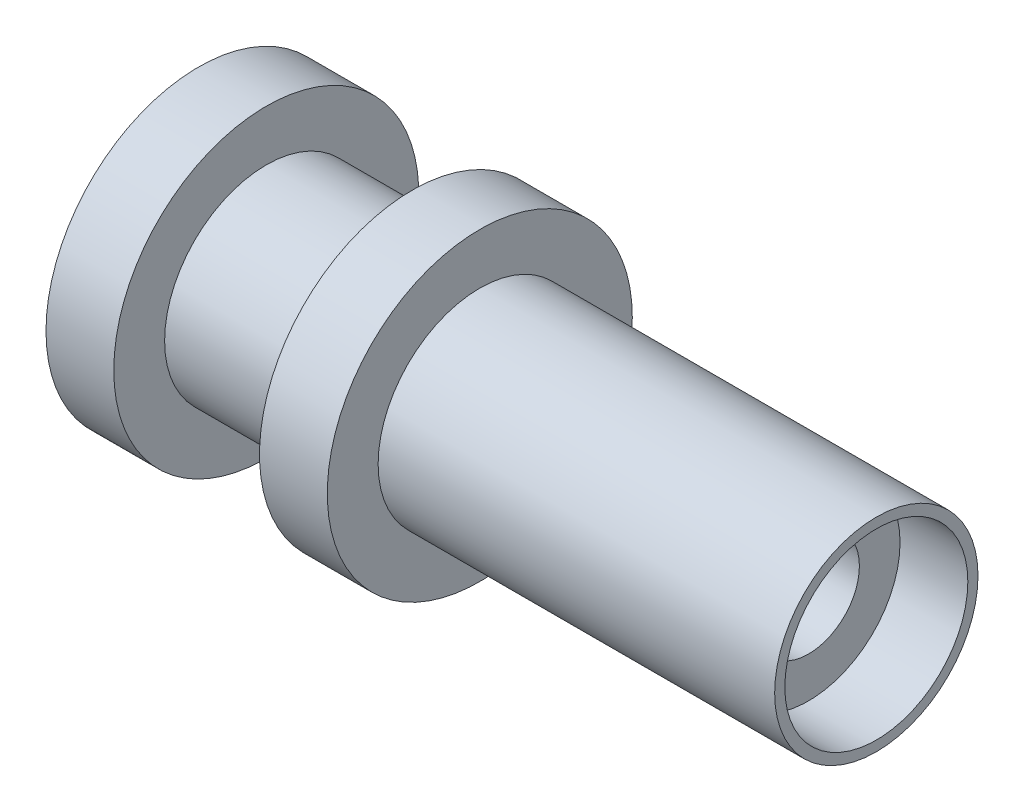
ISO-10303-21;
HEADER;
FILE_DESCRIPTION(('STEP AP214'),'2;1');
FILE_NAME('part.step','',(''),(''),'','','');
FILE_SCHEMA(('AUTOMOTIVE_DESIGN { 1 0 10303 214 1 1 1 1 }'));
ENDSEC;
DATA;
#1=APPLICATION_CONTEXT('core data for automotive mechanical design processes');
#2=APPLICATION_PROTOCOL_DEFINITION('international standard','automotive_design',2000,#1);
#3=PRODUCT_CONTEXT('',#1,'mechanical');
#4=PRODUCT('Part','Part','',(#3));
#5=PRODUCT_RELATED_PRODUCT_CATEGORY('part','',(#4));
#6=PRODUCT_DEFINITION_FORMATION('','',#4);
#7=PRODUCT_DEFINITION_CONTEXT('part definition',#1,'design');
#8=PRODUCT_DEFINITION('design','',#6,#7);
#9=PRODUCT_DEFINITION_SHAPE('','',#8);
#10=(LENGTH_UNIT() NAMED_UNIT(*) SI_UNIT(.MILLI.,.METRE.));
#11=(NAMED_UNIT(*) PLANE_ANGLE_UNIT() SI_UNIT($,.RADIAN.));
#12=(NAMED_UNIT(*) SI_UNIT($,.STERADIAN.) SOLID_ANGLE_UNIT());
#13=UNCERTAINTY_MEASURE_WITH_UNIT(LENGTH_MEASURE(1.E-05),#10,'distance_accuracy_value','');
#14=(GEOMETRIC_REPRESENTATION_CONTEXT(3) GLOBAL_UNCERTAINTY_ASSIGNED_CONTEXT((#13)) GLOBAL_UNIT_ASSIGNED_CONTEXT((#10,
#11,#12)) REPRESENTATION_CONTEXT('',''));
#15=CARTESIAN_POINT('',(0.,0.,0.));
#16=DIRECTION('',(0.,0.,1.));
#17=DIRECTION('',(1.,0.,0.));
#18=AXIS2_PLACEMENT_3D('',#15,#16,#17);
#19=CARTESIAN_POINT('',(-2.,0.,0.));
#20=DIRECTION('',(-1.,0.,0.));
#21=DIRECTION('',(0.,0.,1.));
#22=AXIS2_PLACEMENT_3D('',#19,#20,#21);
#23=PLANE('',#22);
#24=CARTESIAN_POINT('',(-2.,0.,0.));
#25=DIRECTION('',(-1.,0.,0.));
#26=DIRECTION('',(0.,0.,1.));
#27=AXIS2_PLACEMENT_3D('',#24,#25,#26);
#28=CIRCLE('',#27,4.5);
#29=CARTESIAN_POINT('',(-2.,0.,4.5));
#30=VERTEX_POINT('',#29);
#31=EDGE_CURVE('E147',#30,#30,#28,.T.);
#32=ORIENTED_EDGE('',*,*,#31,.T.);
#33=EDGE_LOOP('',(#32));
#34=FACE_BOUND('',#33,.T.);
#35=DIRECTION('',(0.,-1.,0.));
#36=VECTOR('',#35,1.);
#37=CARTESIAN_POINT('',(-2.,0.,2.8));
#38=LINE('',#37,#36);
#39=CARTESIAN_POINT('',(-2.,1.61658075373095,2.8));
#40=VERTEX_POINT('',#39);
#41=CARTESIAN_POINT('',(-2.,-1.61658075373095,2.8));
#42=VERTEX_POINT('',#41);
#43=EDGE_CURVE('E49',#40,#42,#38,.T.);
#44=ORIENTED_EDGE('',*,*,#43,.T.);
#45=DIRECTION('',(0.,-0.5,-0.866025403784439));
#46=VECTOR('',#45,1.);
#47=CARTESIAN_POINT('',(-2.,-2.42487113059643,1.4));
#48=LINE('',#47,#46);
#49=CARTESIAN_POINT('',(-2.,-3.2331615074619,0.));
#50=VERTEX_POINT('',#49);
#51=EDGE_CURVE('E11',#42,#50,#48,.T.);
#52=ORIENTED_EDGE('',*,*,#51,.T.);
#53=DIRECTION('',(0.,0.5,-0.866025403784439));
#54=VECTOR('',#53,1.);
#55=CARTESIAN_POINT('',(-2.,-2.42487113059643,-1.4));
#56=LINE('',#55,#54);
#57=CARTESIAN_POINT('',(-2.,-1.61658075373095,-2.8));
#58=VERTEX_POINT('',#57);
#59=EDGE_CURVE('E142',#50,#58,#56,.T.);
#60=ORIENTED_EDGE('',*,*,#59,.T.);
#61=DIRECTION('',(0.,1.,0.));
#62=VECTOR('',#61,1.);
#63=CARTESIAN_POINT('',(-2.,0.,-2.8));
#64=LINE('',#63,#62);
#65=CARTESIAN_POINT('',(-2.,1.61658075373095,-2.8));
#66=VERTEX_POINT('',#65);
#67=EDGE_CURVE('E170',#58,#66,#64,.T.);
#68=ORIENTED_EDGE('',*,*,#67,.T.);
#69=DIRECTION('',(0.,0.5,0.866025403784439));
#70=VECTOR('',#69,1.);
#71=CARTESIAN_POINT('',(-2.,2.42487113059643,-1.4));
#72=LINE('',#71,#70);
#73=CARTESIAN_POINT('',(-2.,3.2331615074619,0.));
#74=VERTEX_POINT('',#73);
#75=EDGE_CURVE('E173',#66,#74,#72,.T.);
#76=ORIENTED_EDGE('',*,*,#75,.T.);
#77=DIRECTION('',(0.,-0.5,0.866025403784439));
#78=VECTOR('',#77,1.);
#79=CARTESIAN_POINT('',(-2.,2.42487113059643,1.4));
#80=LINE('',#79,#78);
#81=EDGE_CURVE('E176',#74,#40,#80,.T.);
#82=ORIENTED_EDGE('',*,*,#81,.T.);
#83=EDGE_LOOP('',(#44,#52,#60,#68,#76,#82));
#84=FACE_BOUND('',#83,.T.);
#85=ADVANCED_FACE('F41',(#34,#84),#23,.T.);
#86=CARTESIAN_POINT('',(0.,0.,0.));
#87=DIRECTION('',(1.,0.,0.));
#88=DIRECTION('',(0.,0.,-1.));
#89=AXIS2_PLACEMENT_3D('',#86,#87,#88);
#90=CYLINDRICAL_SURFACE('',#89,1.5);
#91=CARTESIAN_POINT('',(16.,0.,0.));
#92=DIRECTION('',(1.,0.,0.));
#93=DIRECTION('',(0.,0.,-1.));
#94=AXIS2_PLACEMENT_3D('',#91,#92,#93);
#95=CIRCLE('',#94,1.5);
#96=CARTESIAN_POINT('',(16.,0.,-1.5));
#97=VERTEX_POINT('',#96);
#98=EDGE_CURVE('E159',#97,#97,#95,.T.);
#99=ORIENTED_EDGE('',*,*,#98,.T.);
#100=EDGE_LOOP('',(#99));
#101=FACE_BOUND('',#100,.T.);
#102=CARTESIAN_POINT('',(-1.,0.,0.));
#103=DIRECTION('',(-1.,0.,0.));
#104=DIRECTION('',(0.,0.,1.));
#105=AXIS2_PLACEMENT_3D('',#102,#103,#104);
#106=CIRCLE('',#105,1.5);
#107=CARTESIAN_POINT('',(-1.,0.,1.5));
#108=VERTEX_POINT('',#107);
#109=EDGE_CURVE('E99',#108,#108,#106,.F.);
#110=ORIENTED_EDGE('',*,*,#109,.F.);
#111=EDGE_LOOP('',(#110));
#112=FACE_BOUND('',#111,.T.);
#113=ADVANCED_FACE('F198',(#101,#112),#90,.F.);
#114=CARTESIAN_POINT('',(18.,0.,0.));
#115=DIRECTION('',(-1.,0.,0.));
#116=DIRECTION('',(0.,0.,1.));
#117=AXIS2_PLACEMENT_3D('',#114,#115,#116);
#118=CYLINDRICAL_SURFACE('',#117,3.);
#119=CARTESIAN_POINT('',(0.,0.,0.));
#120=DIRECTION('',(1.,0.,0.));
#121=DIRECTION('',(0.,0.,-1.));
#122=AXIS2_PLACEMENT_3D('',#119,#120,#121);
#123=CIRCLE('',#122,3.);
#124=CARTESIAN_POINT('',(0.,0.,-3.));
#125=VERTEX_POINT('',#124);
#126=EDGE_CURVE('E150',#125,#125,#123,.T.);
#127=ORIENTED_EDGE('',*,*,#126,.T.);
#128=EDGE_LOOP('',(#127));
#129=FACE_BOUND('',#128,.T.);
#130=CARTESIAN_POINT('',(4.30000000000008,0.,0.));
#131=DIRECTION('',(1.,0.,0.));
#132=DIRECTION('',(0.,0.,-1.));
#133=AXIS2_PLACEMENT_3D('',#130,#131,#132);
#134=CIRCLE('',#133,3.);
#135=CARTESIAN_POINT('',(4.30000000000008,0.,-3.));
#136=VERTEX_POINT('',#135);
#137=EDGE_CURVE('E139',#136,#136,#134,.T.);
#138=ORIENTED_EDGE('',*,*,#137,.F.);
#139=EDGE_LOOP('',(#138));
#140=FACE_BOUND('',#139,.T.);
#141=ADVANCED_FACE('F205',(#129,#140),#118,.T.);
#142=CARTESIAN_POINT('',(0.,0.,0.));
#143=DIRECTION('',(-1.,0.,0.));
#144=DIRECTION('',(0.,0.,1.));
#145=AXIS2_PLACEMENT_3D('',#142,#143,#144);
#146=PLANE('',#145);
#147=ORIENTED_EDGE('',*,*,#126,.F.);
#148=EDGE_LOOP('',(#147));
#149=FACE_BOUND('',#148,.T.);
#150=CARTESIAN_POINT('',(0.,0.,0.));
#151=DIRECTION('',(-1.,0.,0.));
#152=DIRECTION('',(0.,0.,1.));
#153=AXIS2_PLACEMENT_3D('',#150,#151,#152);
#154=CIRCLE('',#153,4.5);
#155=CARTESIAN_POINT('',(0.,0.,4.5));
#156=VERTEX_POINT('',#155);
#157=EDGE_CURVE('E146',#156,#156,#154,.T.);
#158=ORIENTED_EDGE('',*,*,#157,.F.);
#159=EDGE_LOOP('',(#158));
#160=FACE_BOUND('',#159,.T.);
#161=ADVANCED_FACE('F212',(#149,#160),#146,.F.);
#162=CARTESIAN_POINT('',(-2.,0.,0.));
#163=DIRECTION('',(1.,0.,0.));
#164=DIRECTION('',(0.,0.,-1.));
#165=AXIS2_PLACEMENT_3D('',#162,#163,#164);
#166=CYLINDRICAL_SURFACE('',#165,4.5);
#167=ORIENTED_EDGE('',*,*,#31,.F.);
#168=EDGE_LOOP('',(#167));
#169=FACE_BOUND('',#168,.T.);
#170=ORIENTED_EDGE('',*,*,#157,.T.);
#171=EDGE_LOOP('',(#170));
#172=FACE_BOUND('',#171,.T.);
#173=ADVANCED_FACE('F215',(#169,#172),#166,.T.);
#174=CARTESIAN_POINT('',(6.30000000000008,0.,0.));
#175=DIRECTION('',(1.,0.,0.));
#176=DIRECTION('',(0.,0.,-1.));
#177=AXIS2_PLACEMENT_3D('',#174,#175,#176);
#178=PLANE('',#177);
#179=CARTESIAN_POINT('',(6.30000000000008,0.,0.));
#180=DIRECTION('',(1.,0.,0.));
#181=DIRECTION('',(0.,0.,-1.));
#182=AXIS2_PLACEMENT_3D('',#179,#180,#181);
#183=CIRCLE('',#182,4.5);
#184=CARTESIAN_POINT('',(6.30000000000008,0.,-4.5));
#185=VERTEX_POINT('',#184);
#186=EDGE_CURVE('E132',#185,#185,#183,.T.);
#187=ORIENTED_EDGE('',*,*,#186,.T.);
#188=EDGE_LOOP('',(#187));
#189=FACE_BOUND('',#188,.T.);
#190=CARTESIAN_POINT('',(6.30000000000008,0.,0.));
#191=DIRECTION('',(1.,0.,0.));
#192=DIRECTION('',(0.,0.,-1.));
#193=AXIS2_PLACEMENT_3D('',#190,#191,#192);
#194=CIRCLE('',#193,3.);
#195=CARTESIAN_POINT('',(6.30000000000008,0.,-3.));
#196=VERTEX_POINT('',#195);
#197=EDGE_CURVE('E135',#196,#196,#194,.T.);
#198=ORIENTED_EDGE('',*,*,#197,.F.);
#199=EDGE_LOOP('',(#198));
#200=FACE_BOUND('',#199,.T.);
#201=ADVANCED_FACE('F218',(#189,#200),#178,.T.);
#202=CARTESIAN_POINT('',(4.30000000000008,0.,0.));
#203=DIRECTION('',(1.,0.,0.));
#204=DIRECTION('',(0.,0.,-1.));
#205=AXIS2_PLACEMENT_3D('',#202,#203,#204);
#206=PLANE('',#205);
#207=CARTESIAN_POINT('',(4.30000000000008,0.,0.));
#208=DIRECTION('',(1.,0.,0.));
#209=DIRECTION('',(0.,0.,-1.));
#210=AXIS2_PLACEMENT_3D('',#207,#208,#209);
#211=CIRCLE('',#210,4.5);
#212=CARTESIAN_POINT('',(4.30000000000008,0.,-4.5));
#213=VERTEX_POINT('',#212);
#214=EDGE_CURVE('E136',#213,#213,#211,.T.);
#215=ORIENTED_EDGE('',*,*,#214,.F.);
#216=EDGE_LOOP('',(#215));
#217=FACE_BOUND('',#216,.T.);
#218=ORIENTED_EDGE('',*,*,#137,.T.);
#219=EDGE_LOOP('',(#218));
#220=FACE_BOUND('',#219,.T.);
#221=ADVANCED_FACE('F235',(#217,#220),#206,.F.);
#222=CARTESIAN_POINT('',(6.30000000000008,0.,0.));
#223=DIRECTION('',(-1.,0.,0.));
#224=DIRECTION('',(0.,0.,1.));
#225=AXIS2_PLACEMENT_3D('',#222,#223,#224);
#226=CYLINDRICAL_SURFACE('',#225,4.5);
#227=ORIENTED_EDGE('',*,*,#186,.F.);
#228=EDGE_LOOP('',(#227));
#229=FACE_BOUND('',#228,.T.);
#230=ORIENTED_EDGE('',*,*,#214,.T.);
#231=EDGE_LOOP('',(#230));
#232=FACE_BOUND('',#231,.T.);
#233=ADVANCED_FACE('F210',(#229,#232),#226,.T.);
#234=CARTESIAN_POINT('',(18.,0.,0.));
#235=DIRECTION('',(1.,0.,0.));
#236=DIRECTION('',(0.,0.,-1.));
#237=AXIS2_PLACEMENT_3D('',#234,#235,#236);
#238=PLANE('',#237);
#239=CARTESIAN_POINT('',(18.,0.,0.));
#240=DIRECTION('',(1.,0.,0.));
#241=DIRECTION('',(0.,0.,-1.));
#242=AXIS2_PLACEMENT_3D('',#239,#240,#241);
#243=CIRCLE('',#242,2.7);
#244=CARTESIAN_POINT('',(18.,0.,-2.7));
#245=VERTEX_POINT('',#244);
#246=EDGE_CURVE('E156',#245,#245,#243,.T.);
#247=ORIENTED_EDGE('',*,*,#246,.F.);
#248=EDGE_LOOP('',(#247));
#249=FACE_BOUND('',#248,.T.);
#250=CARTESIAN_POINT('',(18.,0.,0.));
#251=DIRECTION('',(1.,0.,0.));
#252=DIRECTION('',(0.,0.,-1.));
#253=AXIS2_PLACEMENT_3D('',#250,#251,#252);
#254=CIRCLE('',#253,3.);
#255=CARTESIAN_POINT('',(18.,0.,-3.));
#256=VERTEX_POINT('',#255);
#257=EDGE_CURVE('E143',#256,#256,#254,.T.);
#258=ORIENTED_EDGE('',*,*,#257,.T.);
#259=EDGE_LOOP('',(#258));
#260=FACE_BOUND('',#259,.T.);
#261=ADVANCED_FACE('F228',(#249,#260),#238,.T.);
#262=ORIENTED_EDGE('',*,*,#197,.T.);
#263=EDGE_LOOP('',(#262));
#264=FACE_BOUND('',#263,.T.);
#265=ORIENTED_EDGE('',*,*,#257,.F.);
#266=EDGE_LOOP('',(#265));
#267=FACE_BOUND('',#266,.T.);
#268=ADVANCED_FACE('F43',(#264,#267),#118,.T.);
#269=CARTESIAN_POINT('',(16.,0.,0.));
#270=DIRECTION('',(1.,0.,0.));
#271=DIRECTION('',(0.,0.,-1.));
#272=AXIS2_PLACEMENT_3D('',#269,#270,#271);
#273=CYLINDRICAL_SURFACE('',#272,2.7);
#274=CARTESIAN_POINT('',(16.,0.,0.));
#275=DIRECTION('',(1.,0.,0.));
#276=DIRECTION('',(0.,0.,-1.));
#277=AXIS2_PLACEMENT_3D('',#274,#275,#276);
#278=CIRCLE('',#277,2.7);
#279=CARTESIAN_POINT('',(16.,0.,-2.7));
#280=VERTEX_POINT('',#279);
#281=EDGE_CURVE('E153',#280,#280,#278,.T.);
#282=ORIENTED_EDGE('',*,*,#281,.F.);
#283=EDGE_LOOP('',(#282));
#284=FACE_BOUND('',#283,.T.);
#285=ORIENTED_EDGE('',*,*,#246,.T.);
#286=EDGE_LOOP('',(#285));
#287=FACE_BOUND('',#286,.T.);
#288=ADVANCED_FACE('F224',(#284,#287),#273,.F.);
#289=CARTESIAN_POINT('',(16.,0.,0.));
#290=DIRECTION('',(1.,0.,0.));
#291=DIRECTION('',(0.,0.,-1.));
#292=AXIS2_PLACEMENT_3D('',#289,#290,#291);
#293=PLANE('',#292);
#294=ORIENTED_EDGE('',*,*,#98,.F.);
#295=EDGE_LOOP('',(#294));
#296=FACE_BOUND('',#295,.T.);
#297=ORIENTED_EDGE('',*,*,#281,.T.);
#298=EDGE_LOOP('',(#297));
#299=FACE_BOUND('',#298,.T.);
#300=ADVANCED_FACE('F221',(#296,#299),#293,.T.);
#301=CARTESIAN_POINT('',(-1.,0.,0.));
#302=DIRECTION('',(-1.,0.,0.));
#303=DIRECTION('',(0.,0.,1.));
#304=AXIS2_PLACEMENT_3D('',#301,#302,#303);
#305=PLANE('',#304);
#306=DIRECTION('',(0.,0.5,0.866025403784439));
#307=VECTOR('',#306,1.);
#308=CARTESIAN_POINT('',(-1.,-3.2331615074619,0.));
#309=LINE('',#308,#307);
#310=CARTESIAN_POINT('',(-1.,-3.2331615074619,0.));
#311=VERTEX_POINT('',#310);
#312=CARTESIAN_POINT('',(-1.,-1.61658075373095,2.8));
#313=VERTEX_POINT('',#312);
#314=EDGE_CURVE('E95',#311,#313,#309,.T.);
#315=ORIENTED_EDGE('',*,*,#314,.T.);
#316=DIRECTION('',(0.,1.,0.));
#317=VECTOR('',#316,1.);
#318=CARTESIAN_POINT('',(-1.,-1.61658075373095,2.8));
#319=LINE('',#318,#317);
#320=CARTESIAN_POINT('',(-1.,1.61658075373095,2.8));
#321=VERTEX_POINT('',#320);
#322=EDGE_CURVE('E103',#313,#321,#319,.T.);
#323=ORIENTED_EDGE('',*,*,#322,.T.);
#324=DIRECTION('',(0.,0.5,-0.866025403784439));
#325=VECTOR('',#324,1.);
#326=CARTESIAN_POINT('',(-1.,1.61658075373095,2.8));
#327=LINE('',#326,#325);
#328=CARTESIAN_POINT('',(-1.,3.2331615074619,0.));
#329=VERTEX_POINT('',#328);
#330=EDGE_CURVE('E109',#321,#329,#327,.T.);
#331=ORIENTED_EDGE('',*,*,#330,.T.);
#332=DIRECTION('',(0.,-0.5,-0.866025403784439));
#333=VECTOR('',#332,1.);
#334=CARTESIAN_POINT('',(-1.,3.2331615074619,0.));
#335=LINE('',#334,#333);
#336=CARTESIAN_POINT('',(-1.,1.61658075373095,-2.8));
#337=VERTEX_POINT('',#336);
#338=EDGE_CURVE('E118',#329,#337,#335,.T.);
#339=ORIENTED_EDGE('',*,*,#338,.T.);
#340=DIRECTION('',(0.,-1.,0.));
#341=VECTOR('',#340,1.);
#342=CARTESIAN_POINT('',(-1.,1.61658075373095,-2.8));
#343=LINE('',#342,#341);
#344=CARTESIAN_POINT('',(-1.,-1.61658075373095,-2.8));
#345=VERTEX_POINT('',#344);
#346=EDGE_CURVE('E121',#337,#345,#343,.T.);
#347=ORIENTED_EDGE('',*,*,#346,.T.);
#348=DIRECTION('',(0.,-0.5,0.866025403784439));
#349=VECTOR('',#348,1.);
#350=CARTESIAN_POINT('',(-1.,-1.61658075373095,-2.8));
#351=LINE('',#350,#349);
#352=EDGE_CURVE('E114',#345,#311,#351,.T.);
#353=ORIENTED_EDGE('',*,*,#352,.T.);
#354=EDGE_LOOP('',(#315,#323,#331,#339,#347,#353));
#355=FACE_BOUND('',#354,.T.);
#356=ORIENTED_EDGE('',*,*,#109,.T.);
#357=EDGE_LOOP('',(#356));
#358=FACE_BOUND('',#357,.T.);
#359=ADVANCED_FACE('F111',(#355,#358),#305,.T.);
#360=CARTESIAN_POINT('',(-2.000012,-3.2331615074619,0.));
#361=DIRECTION('',(0.,0.866025403784439,-0.5));
#362=DIRECTION('',(0.,0.5,0.866025403784439));
#363=AXIS2_PLACEMENT_3D('',#360,#361,#362);
#364=PLANE('',#363);
#365=DIRECTION('',(1.,0.,0.));
#366=VECTOR('',#365,1.);
#367=CARTESIAN_POINT('',(-2.000012,-1.61658075373095,2.8));
#368=LINE('',#367,#366);
#369=EDGE_CURVE('E91',#42,#313,#368,.T.);
#370=ORIENTED_EDGE('',*,*,#369,.T.);
#371=ORIENTED_EDGE('',*,*,#314,.F.);
#372=DIRECTION('',(1.,0.,0.));
#373=VECTOR('',#372,1.);
#374=CARTESIAN_POINT('',(-2.000012,-3.2331615074619,0.));
#375=LINE('',#374,#373);
#376=EDGE_CURVE('E124',#50,#311,#375,.T.);
#377=ORIENTED_EDGE('',*,*,#376,.F.);
#378=ORIENTED_EDGE('',*,*,#51,.F.);
#379=EDGE_LOOP('',(#370,#371,#377,#378));
#380=FACE_BOUND('',#379,.T.);
#381=ADVANCED_FACE('F93',(#380),#364,.T.);
#382=CARTESIAN_POINT('',(-2.000012,-1.61658075373095,2.8));
#383=DIRECTION('',(0.,0.,-1.));
#384=DIRECTION('',(-1.,0.,0.));
#385=AXIS2_PLACEMENT_3D('',#382,#383,#384);
#386=PLANE('',#385);
#387=DIRECTION('',(1.,0.,0.));
#388=VECTOR('',#387,1.);
#389=CARTESIAN_POINT('',(-2.000012,1.61658075373095,2.8));
#390=LINE('',#389,#388);
#391=EDGE_CURVE('E100',#40,#321,#390,.T.);
#392=ORIENTED_EDGE('',*,*,#391,.T.);
#393=ORIENTED_EDGE('',*,*,#322,.F.);
#394=ORIENTED_EDGE('',*,*,#369,.F.);
#395=ORIENTED_EDGE('',*,*,#43,.F.);
#396=EDGE_LOOP('',(#392,#393,#394,#395));
#397=FACE_BOUND('',#396,.T.);
#398=ADVANCED_FACE('F104',(#397),#386,.T.);
#399=CARTESIAN_POINT('',(-2.000012,1.61658075373095,2.8));
#400=DIRECTION('',(0.,-0.866025403784439,-0.5));
#401=DIRECTION('',(0.,0.5,-0.866025403784439));
#402=AXIS2_PLACEMENT_3D('',#399,#400,#401);
#403=PLANE('',#402);
#404=DIRECTION('',(1.,0.,0.));
#405=VECTOR('',#404,1.);
#406=CARTESIAN_POINT('',(-2.000012,3.2331615074619,0.));
#407=LINE('',#406,#405);
#408=EDGE_CURVE('E129',#74,#329,#407,.T.);
#409=ORIENTED_EDGE('',*,*,#408,.T.);
#410=ORIENTED_EDGE('',*,*,#330,.F.);
#411=ORIENTED_EDGE('',*,*,#391,.F.);
#412=ORIENTED_EDGE('',*,*,#81,.F.);
#413=EDGE_LOOP('',(#409,#410,#411,#412));
#414=FACE_BOUND('',#413,.T.);
#415=ADVANCED_FACE('F180',(#414),#403,.T.);
#416=CARTESIAN_POINT('',(-2.000012,3.2331615074619,0.));
#417=DIRECTION('',(0.,-0.866025403784439,0.5));
#418=DIRECTION('',(0.,-0.5,-0.866025403784439));
#419=AXIS2_PLACEMENT_3D('',#416,#417,#418);
#420=PLANE('',#419);
#421=DIRECTION('',(1.,0.,0.));
#422=VECTOR('',#421,1.);
#423=CARTESIAN_POINT('',(-2.000012,1.61658075373095,-2.8));
#424=LINE('',#423,#422);
#425=EDGE_CURVE('E127',#66,#337,#424,.T.);
#426=ORIENTED_EDGE('',*,*,#425,.T.);
#427=ORIENTED_EDGE('',*,*,#338,.F.);
#428=ORIENTED_EDGE('',*,*,#408,.F.);
#429=ORIENTED_EDGE('',*,*,#75,.F.);
#430=EDGE_LOOP('',(#426,#427,#428,#429));
#431=FACE_BOUND('',#430,.T.);
#432=ADVANCED_FACE('F185',(#431),#420,.T.);
#433=CARTESIAN_POINT('',(-2.000012,1.61658075373095,-2.8));
#434=DIRECTION('',(0.,0.,1.));
#435=DIRECTION('',(1.,0.,0.));
#436=AXIS2_PLACEMENT_3D('',#433,#434,#435);
#437=PLANE('',#436);
#438=DIRECTION('',(1.,0.,0.));
#439=VECTOR('',#438,1.);
#440=CARTESIAN_POINT('',(-2.000012,-1.61658075373095,-2.8));
#441=LINE('',#440,#439);
#442=EDGE_CURVE('E56',#58,#345,#441,.T.);
#443=ORIENTED_EDGE('',*,*,#442,.T.);
#444=ORIENTED_EDGE('',*,*,#346,.F.);
#445=ORIENTED_EDGE('',*,*,#425,.F.);
#446=ORIENTED_EDGE('',*,*,#67,.F.);
#447=EDGE_LOOP('',(#443,#444,#445,#446));
#448=FACE_BOUND('',#447,.T.);
#449=ADVANCED_FACE('F188',(#448),#437,.T.);
#450=CARTESIAN_POINT('',(-2.000012,-1.61658075373095,-2.8));
#451=DIRECTION('',(0.,0.866025403784439,0.5));
#452=DIRECTION('',(0.,-0.5,0.866025403784439));
#453=AXIS2_PLACEMENT_3D('',#450,#451,#452);
#454=PLANE('',#453);
#455=ORIENTED_EDGE('',*,*,#376,.T.);
#456=ORIENTED_EDGE('',*,*,#352,.F.);
#457=ORIENTED_EDGE('',*,*,#442,.F.);
#458=ORIENTED_EDGE('',*,*,#59,.F.);
#459=EDGE_LOOP('',(#455,#456,#457,#458));
#460=FACE_BOUND('',#459,.T.);
#461=ADVANCED_FACE('F189',(#460),#454,.T.);
#462=CLOSED_SHELL('',(#85,#113,#141,#161,#173,#201,#221,#233,#261,#268,#288,#300,#359,#381,#398,
#415,#432,#449,#461));
#463=MANIFOLD_SOLID_BREP('B2',#462);
#464=ADVANCED_BREP_SHAPE_REPRESENTATION('',(#18,#463),#14);
#465=SHAPE_DEFINITION_REPRESENTATION(#9,#464);
ENDSEC;
END-ISO-10303-21;
